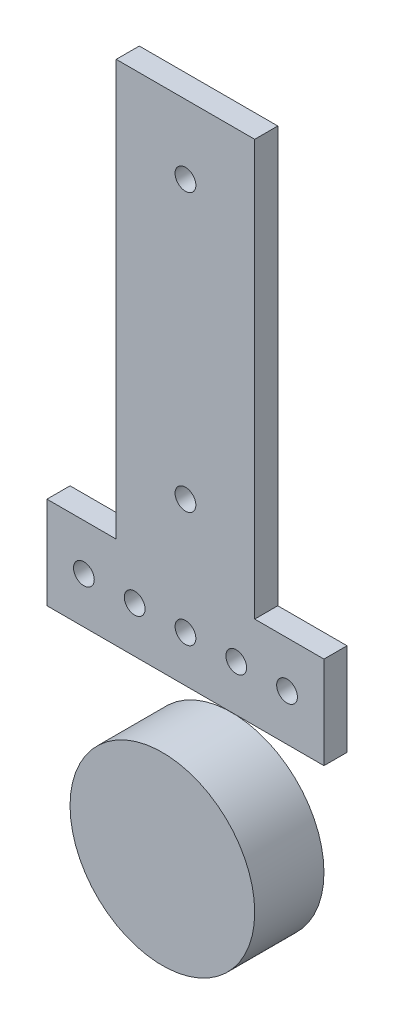
ISO-10303-21;
HEADER;
FILE_DESCRIPTION(('STEP AP214'),'2;1');
FILE_NAME('part.step','',(''),(''),'','','');
FILE_SCHEMA(('AUTOMOTIVE_DESIGN { 1 0 10303 214 1 1 1 1 }'));
ENDSEC;
DATA;
#1=APPLICATION_CONTEXT('core data for automotive mechanical design processes');
#2=APPLICATION_PROTOCOL_DEFINITION('international standard','automotive_design',2000,#1);
#3=PRODUCT_CONTEXT('',#1,'mechanical');
#4=PRODUCT('Part','Part','',(#3));
#5=PRODUCT_RELATED_PRODUCT_CATEGORY('part','',(#4));
#6=PRODUCT_DEFINITION_FORMATION('','',#4);
#7=PRODUCT_DEFINITION_CONTEXT('part definition',#1,'design');
#8=PRODUCT_DEFINITION('design','',#6,#7);
#9=PRODUCT_DEFINITION_SHAPE('','',#8);
#10=(LENGTH_UNIT() NAMED_UNIT(*) SI_UNIT(.MILLI.,.METRE.));
#11=(NAMED_UNIT(*) PLANE_ANGLE_UNIT() SI_UNIT($,.RADIAN.));
#12=(NAMED_UNIT(*) SI_UNIT($,.STERADIAN.) SOLID_ANGLE_UNIT());
#13=UNCERTAINTY_MEASURE_WITH_UNIT(LENGTH_MEASURE(1.E-05),#10,'distance_accuracy_value','');
#14=(GEOMETRIC_REPRESENTATION_CONTEXT(3) GLOBAL_UNCERTAINTY_ASSIGNED_CONTEXT((#13)) GLOBAL_UNIT_ASSIGNED_CONTEXT((#10,
#11,#12)) REPRESENTATION_CONTEXT('',''));
#15=CARTESIAN_POINT('',(0.,0.,0.));
#16=DIRECTION('',(0.,0.,1.));
#17=DIRECTION('',(1.,0.,0.));
#18=AXIS2_PLACEMENT_3D('',#15,#16,#17);
#19=CARTESIAN_POINT('',(0.,-65.,7.5));
#20=DIRECTION('',(0.,0.,-1.));
#21=DIRECTION('',(-1.,0.,0.));
#22=AXIS2_PLACEMENT_3D('',#19,#20,#21);
#23=CYLINDRICAL_SURFACE('',#22,20.);
#24=CARTESIAN_POINT('',(0.,-65.,7.5));
#25=DIRECTION('',(0.,0.,1.));
#26=DIRECTION('',(1.,0.,0.));
#27=AXIS2_PLACEMENT_3D('',#24,#25,#26);
#28=CIRCLE('',#27,20.);
#29=CARTESIAN_POINT('',(20.,-65.,7.5));
#30=VERTEX_POINT('',#29);
#31=EDGE_CURVE('E11',#30,#30,#28,.T.);
#32=ORIENTED_EDGE('',*,*,#31,.F.);
#33=EDGE_LOOP('',(#32));
#34=FACE_BOUND('',#33,.T.);
#35=CARTESIAN_POINT('',(0.,-65.,-7.5));
#36=DIRECTION('',(0.,0.,1.));
#37=DIRECTION('',(1.,0.,0.));
#38=AXIS2_PLACEMENT_3D('',#35,#36,#37);
#39=CIRCLE('',#38,20.);
#40=CARTESIAN_POINT('',(20.,-65.,-7.5));
#41=VERTEX_POINT('',#40);
#42=EDGE_CURVE('E50',#41,#41,#39,.T.);
#43=ORIENTED_EDGE('',*,*,#42,.T.);
#44=EDGE_LOOP('',(#43));
#45=FACE_BOUND('',#44,.T.);
#46=ADVANCED_FACE('F47',(#34,#45),#23,.T.);
#47=CARTESIAN_POINT('',(0.,0.,7.5));
#48=DIRECTION('',(0.,0.,1.));
#49=DIRECTION('',(1.,0.,0.));
#50=AXIS2_PLACEMENT_3D('',#47,#48,#49);
#51=PLANE('',#50);
#52=ORIENTED_EDGE('',*,*,#31,.T.);
#53=EDGE_LOOP('',(#52));
#54=FACE_BOUND('',#53,.T.);
#55=ADVANCED_FACE('F62',(#54),#51,.T.);
#56=CARTESIAN_POINT('',(0.,0.,-7.5));
#57=DIRECTION('',(0.,0.,1.));
#58=DIRECTION('',(1.,0.,0.));
#59=AXIS2_PLACEMENT_3D('',#56,#57,#58);
#60=PLANE('',#59);
#61=ORIENTED_EDGE('',*,*,#42,.F.);
#62=EDGE_LOOP('',(#61));
#63=FACE_BOUND('',#62,.T.);
#64=ADVANCED_FACE('F60',(#63),#60,.F.);
#65=CLOSED_SHELL('',(#46,#55,#64));
#66=MANIFOLD_SOLID_BREP('B2',#65);
#67=CARTESIAN_POINT('',(-14.9999999999998,0.,2.5));
#68=DIRECTION('',(-1.,0.,0.));
#69=DIRECTION('',(0.,-1.,0.));
#70=AXIS2_PLACEMENT_3D('',#67,#68,#69);
#71=PLANE('',#70);
#72=DIRECTION('',(0.,1.,0.));
#73=VECTOR('',#72,1.);
#74=CARTESIAN_POINT('',(-14.9999999999998,0.,-2.5));
#75=LINE('',#74,#73);
#76=CARTESIAN_POINT('',(-14.9999999999997,-15.,-2.5));
#77=VERTEX_POINT('',#76);
#78=CARTESIAN_POINT('',(-14.9999999999998,75.,-2.5));
#79=VERTEX_POINT('',#78);
#80=EDGE_CURVE('E255',#77,#79,#75,.T.);
#81=ORIENTED_EDGE('',*,*,#80,.F.);
#82=DIRECTION('',(0.,0.,-1.));
#83=VECTOR('',#82,1.);
#84=CARTESIAN_POINT('',(-14.9999999999997,-15.,2.5));
#85=LINE('',#84,#83);
#86=CARTESIAN_POINT('',(-14.9999999999997,-15.,2.5));
#87=VERTEX_POINT('',#86);
#88=EDGE_CURVE('E45',#87,#77,#85,.T.);
#89=ORIENTED_EDGE('',*,*,#88,.F.);
#90=DIRECTION('',(0.,1.,0.));
#91=VECTOR('',#90,1.);
#92=CARTESIAN_POINT('',(-14.9999999999998,0.,2.5));
#93=LINE('',#92,#91);
#94=CARTESIAN_POINT('',(-14.9999999999998,75.,2.5));
#95=VERTEX_POINT('',#94);
#96=EDGE_CURVE('E193',#87,#95,#93,.T.);
#97=ORIENTED_EDGE('',*,*,#96,.T.);
#98=DIRECTION('',(0.,0.,-1.));
#99=VECTOR('',#98,1.);
#100=CARTESIAN_POINT('',(-14.9999999999998,75.,2.5));
#101=LINE('',#100,#99);
#102=EDGE_CURVE('E140',#95,#79,#101,.T.);
#103=ORIENTED_EDGE('',*,*,#102,.T.);
#104=EDGE_LOOP('',(#81,#89,#97,#103));
#105=FACE_BOUND('',#104,.T.);
#106=ADVANCED_FACE('F87',(#105),#71,.T.);
#107=CARTESIAN_POINT('',(0.,-15.,2.5));
#108=DIRECTION('',(0.,1.,0.));
#109=DIRECTION('',(-1.,0.,0.));
#110=AXIS2_PLACEMENT_3D('',#107,#108,#109);
#111=PLANE('',#110);
#112=DIRECTION('',(1.,0.,0.));
#113=VECTOR('',#112,1.);
#114=CARTESIAN_POINT('',(0.,-15.,-2.5));
#115=LINE('',#114,#113);
#116=CARTESIAN_POINT('',(-30.,-15.,-2.5));
#117=VERTEX_POINT('',#116);
#118=EDGE_CURVE('E247',#117,#77,#115,.T.);
#119=ORIENTED_EDGE('',*,*,#118,.F.);
#120=DIRECTION('',(0.,0.,-1.));
#121=VECTOR('',#120,1.);
#122=CARTESIAN_POINT('',(-30.,-15.,2.5));
#123=LINE('',#122,#121);
#124=CARTESIAN_POINT('',(-30.,-15.,2.5));
#125=VERTEX_POINT('',#124);
#126=EDGE_CURVE('E97',#125,#117,#123,.T.);
#127=ORIENTED_EDGE('',*,*,#126,.F.);
#128=DIRECTION('',(1.,0.,0.));
#129=VECTOR('',#128,1.);
#130=CARTESIAN_POINT('',(0.,-15.,2.5));
#131=LINE('',#130,#129);
#132=EDGE_CURVE('E184',#125,#87,#131,.T.);
#133=ORIENTED_EDGE('',*,*,#132,.T.);
#134=ORIENTED_EDGE('',*,*,#88,.T.);
#135=EDGE_LOOP('',(#119,#127,#133,#134));
#136=FACE_BOUND('',#135,.T.);
#137=ADVANCED_FACE('F253',(#136),#111,.T.);
#138=CARTESIAN_POINT('',(-30.,0.,2.5));
#139=DIRECTION('',(1.,0.,0.));
#140=DIRECTION('',(0.,1.,0.));
#141=AXIS2_PLACEMENT_3D('',#138,#139,#140);
#142=PLANE('',#141);
#143=DIRECTION('',(0.,-1.,0.));
#144=VECTOR('',#143,1.);
#145=CARTESIAN_POINT('',(-30.,0.,-2.5));
#146=LINE('',#145,#144);
#147=CARTESIAN_POINT('',(-30.,-34.9999999999998,-2.5));
#148=VERTEX_POINT('',#147);
#149=EDGE_CURVE('E242',#117,#148,#146,.T.);
#150=ORIENTED_EDGE('',*,*,#149,.T.);
#151=DIRECTION('',(0.,0.,-1.));
#152=VECTOR('',#151,1.);
#153=CARTESIAN_POINT('',(-30.,-34.9999999999998,2.5));
#154=LINE('',#153,#152);
#155=CARTESIAN_POINT('',(-30.,-34.9999999999998,2.5));
#156=VERTEX_POINT('',#155);
#157=EDGE_CURVE('E232',#156,#148,#154,.T.);
#158=ORIENTED_EDGE('',*,*,#157,.F.);
#159=DIRECTION('',(0.,-1.,0.));
#160=VECTOR('',#159,1.);
#161=CARTESIAN_POINT('',(-30.,0.,2.5));
#162=LINE('',#161,#160);
#163=EDGE_CURVE('E192',#125,#156,#162,.T.);
#164=ORIENTED_EDGE('',*,*,#163,.F.);
#165=ORIENTED_EDGE('',*,*,#126,.T.);
#166=EDGE_LOOP('',(#150,#158,#164,#165));
#167=FACE_BOUND('',#166,.T.);
#168=ADVANCED_FACE('F240',(#167),#142,.F.);
#169=CARTESIAN_POINT('',(0.,-34.9999999999998,2.5));
#170=DIRECTION('',(0.,1.,0.));
#171=DIRECTION('',(-1.,0.,0.));
#172=AXIS2_PLACEMENT_3D('',#169,#170,#171);
#173=PLANE('',#172);
#174=DIRECTION('',(1.,0.,0.));
#175=VECTOR('',#174,1.);
#176=CARTESIAN_POINT('',(0.,-34.9999999999998,-2.5));
#177=LINE('',#176,#175);
#178=CARTESIAN_POINT('',(30.,-34.9999999999998,-2.5));
#179=VERTEX_POINT('',#178);
#180=EDGE_CURVE('E250',#148,#179,#177,.T.);
#181=ORIENTED_EDGE('',*,*,#180,.T.);
#182=DIRECTION('',(0.,0.,-1.));
#183=VECTOR('',#182,1.);
#184=CARTESIAN_POINT('',(30.,-34.9999999999998,2.5));
#185=LINE('',#184,#183);
#186=CARTESIAN_POINT('',(30.,-34.9999999999998,2.5));
#187=VERTEX_POINT('',#186);
#188=EDGE_CURVE('E229',#187,#179,#185,.T.);
#189=ORIENTED_EDGE('',*,*,#188,.F.);
#190=DIRECTION('',(1.,0.,0.));
#191=VECTOR('',#190,1.);
#192=CARTESIAN_POINT('',(0.,-34.9999999999998,2.5));
#193=LINE('',#192,#191);
#194=EDGE_CURVE('E186',#156,#187,#193,.T.);
#195=ORIENTED_EDGE('',*,*,#194,.F.);
#196=ORIENTED_EDGE('',*,*,#157,.T.);
#197=EDGE_LOOP('',(#181,#189,#195,#196));
#198=FACE_BOUND('',#197,.T.);
#199=ADVANCED_FACE('F356',(#198),#173,.F.);
#200=CARTESIAN_POINT('',(30.,0.,2.5));
#201=DIRECTION('',(1.,0.,0.));
#202=DIRECTION('',(0.,0.,-1.));
#203=AXIS2_PLACEMENT_3D('',#200,#201,#202);
#204=PLANE('',#203);
#205=DIRECTION('',(0.,-1.,0.));
#206=VECTOR('',#205,1.);
#207=CARTESIAN_POINT('',(30.,0.,-2.5));
#208=LINE('',#207,#206);
#209=CARTESIAN_POINT('',(30.,-15.,-2.5));
#210=VERTEX_POINT('',#209);
#211=EDGE_CURVE('E262',#210,#179,#208,.T.);
#212=ORIENTED_EDGE('',*,*,#211,.F.);
#213=DIRECTION('',(0.,0.,-1.));
#214=VECTOR('',#213,1.);
#215=CARTESIAN_POINT('',(30.,-15.,2.5));
#216=LINE('',#215,#214);
#217=CARTESIAN_POINT('',(30.,-15.,2.5));
#218=VERTEX_POINT('',#217);
#219=EDGE_CURVE('E169',#218,#210,#216,.T.);
#220=ORIENTED_EDGE('',*,*,#219,.F.);
#221=DIRECTION('',(0.,-1.,0.));
#222=VECTOR('',#221,1.);
#223=CARTESIAN_POINT('',(30.,0.,2.5));
#224=LINE('',#223,#222);
#225=EDGE_CURVE('E181',#218,#187,#224,.T.);
#226=ORIENTED_EDGE('',*,*,#225,.T.);
#227=ORIENTED_EDGE('',*,*,#188,.T.);
#228=EDGE_LOOP('',(#212,#220,#226,#227));
#229=FACE_BOUND('',#228,.T.);
#230=ADVANCED_FACE('F358',(#229),#204,.T.);
#231=CARTESIAN_POINT('',(14.9999999999998,-15.,-2.5));
#232=VERTEX_POINT('',#231);
#233=EDGE_CURVE('E165',#232,#210,#115,.T.);
#234=ORIENTED_EDGE('',*,*,#233,.F.);
#235=DIRECTION('',(0.,0.,-1.));
#236=VECTOR('',#235,1.);
#237=CARTESIAN_POINT('',(14.9999999999998,-15.,2.5));
#238=LINE('',#237,#236);
#239=CARTESIAN_POINT('',(14.9999999999998,-15.,2.5));
#240=VERTEX_POINT('',#239);
#241=EDGE_CURVE('E159',#240,#232,#238,.T.);
#242=ORIENTED_EDGE('',*,*,#241,.F.);
#243=EDGE_CURVE('E163',#240,#218,#131,.T.);
#244=ORIENTED_EDGE('',*,*,#243,.T.);
#245=ORIENTED_EDGE('',*,*,#219,.T.);
#246=EDGE_LOOP('',(#234,#242,#244,#245));
#247=FACE_BOUND('',#246,.T.);
#248=ADVANCED_FACE('F161',(#247),#111,.T.);
#249=CARTESIAN_POINT('',(14.9999999999998,0.,2.5));
#250=DIRECTION('',(-1.,0.,0.));
#251=DIRECTION('',(0.,0.,1.));
#252=AXIS2_PLACEMENT_3D('',#249,#250,#251);
#253=PLANE('',#252);
#254=DIRECTION('',(0.,1.,0.));
#255=VECTOR('',#254,1.);
#256=CARTESIAN_POINT('',(14.9999999999998,0.,-2.5));
#257=LINE('',#256,#255);
#258=CARTESIAN_POINT('',(14.9999999999998,75.,-2.5));
#259=VERTEX_POINT('',#258);
#260=EDGE_CURVE('E261',#232,#259,#257,.T.);
#261=ORIENTED_EDGE('',*,*,#260,.T.);
#262=DIRECTION('',(0.,0.,-1.));
#263=VECTOR('',#262,1.);
#264=CARTESIAN_POINT('',(14.9999999999998,75.,2.5));
#265=LINE('',#264,#263);
#266=CARTESIAN_POINT('',(14.9999999999998,75.,2.5));
#267=VERTEX_POINT('',#266);
#268=EDGE_CURVE('E170',#267,#259,#265,.T.);
#269=ORIENTED_EDGE('',*,*,#268,.F.);
#270=DIRECTION('',(0.,1.,0.));
#271=VECTOR('',#270,1.);
#272=CARTESIAN_POINT('',(14.9999999999998,0.,2.5));
#273=LINE('',#272,#271);
#274=EDGE_CURVE('E173',#240,#267,#273,.T.);
#275=ORIENTED_EDGE('',*,*,#274,.F.);
#276=ORIENTED_EDGE('',*,*,#241,.T.);
#277=EDGE_LOOP('',(#261,#269,#275,#276));
#278=FACE_BOUND('',#277,.T.);
#279=ADVANCED_FACE('F174',(#278),#253,.F.);
#280=CARTESIAN_POINT('',(11.,-24.9999999999999,2.5));
#281=DIRECTION('',(0.,0.,-1.));
#282=DIRECTION('',(-1.,0.,0.));
#283=AXIS2_PLACEMENT_3D('',#280,#281,#282);
#284=CYLINDRICAL_SURFACE('',#283,2.25);
#285=CARTESIAN_POINT('',(11.,-24.9999999999999,2.5));
#286=DIRECTION('',(0.,0.,1.));
#287=DIRECTION('',(1.,0.,0.));
#288=AXIS2_PLACEMENT_3D('',#285,#286,#287);
#289=CIRCLE('',#288,2.25);
#290=CARTESIAN_POINT('',(13.25,-24.9999999999999,2.5));
#291=VERTEX_POINT('',#290);
#292=EDGE_CURVE('E336',#291,#291,#289,.T.);
#293=ORIENTED_EDGE('',*,*,#292,.T.);
#294=EDGE_LOOP('',(#293));
#295=FACE_BOUND('',#294,.T.);
#296=CARTESIAN_POINT('',(11.,-24.9999999999999,-2.5));
#297=DIRECTION('',(0.,0.,1.));
#298=DIRECTION('',(1.,0.,0.));
#299=AXIS2_PLACEMENT_3D('',#296,#297,#298);
#300=CIRCLE('',#299,2.25);
#301=CARTESIAN_POINT('',(13.25,-24.9999999999999,-2.5));
#302=VERTEX_POINT('',#301);
#303=EDGE_CURVE('E212',#302,#302,#300,.T.);
#304=ORIENTED_EDGE('',*,*,#303,.F.);
#305=EDGE_LOOP('',(#304));
#306=FACE_BOUND('',#305,.T.);
#307=ADVANCED_FACE('F289',(#295,#306),#284,.F.);
#308=CARTESIAN_POINT('',(22.,-24.9999999999999,2.5));
#309=DIRECTION('',(0.,0.,-1.));
#310=DIRECTION('',(-1.,0.,0.));
#311=AXIS2_PLACEMENT_3D('',#308,#309,#310);
#312=CYLINDRICAL_SURFACE('',#311,2.25);
#313=CARTESIAN_POINT('',(22.,-24.9999999999999,2.5));
#314=DIRECTION('',(0.,0.,1.));
#315=DIRECTION('',(1.,0.,0.));
#316=AXIS2_PLACEMENT_3D('',#313,#314,#315);
#317=CIRCLE('',#316,2.25);
#318=CARTESIAN_POINT('',(24.25,-24.9999999999999,2.5));
#319=VERTEX_POINT('',#318);
#320=EDGE_CURVE('E340',#319,#319,#317,.T.);
#321=ORIENTED_EDGE('',*,*,#320,.T.);
#322=EDGE_LOOP('',(#321));
#323=FACE_BOUND('',#322,.T.);
#324=CARTESIAN_POINT('',(22.,-24.9999999999999,-2.5));
#325=DIRECTION('',(0.,0.,1.));
#326=DIRECTION('',(1.,0.,0.));
#327=AXIS2_PLACEMENT_3D('',#324,#325,#326);
#328=CIRCLE('',#327,2.25);
#329=CARTESIAN_POINT('',(24.25,-24.9999999999999,-2.5));
#330=VERTEX_POINT('',#329);
#331=EDGE_CURVE('E218',#330,#330,#328,.T.);
#332=ORIENTED_EDGE('',*,*,#331,.F.);
#333=EDGE_LOOP('',(#332));
#334=FACE_BOUND('',#333,.T.);
#335=ADVANCED_FACE('F286',(#323,#334),#312,.F.);
#336=CARTESIAN_POINT('',(-11.,-25.,2.5));
#337=DIRECTION('',(0.,0.,-1.));
#338=DIRECTION('',(-1.,0.,0.));
#339=AXIS2_PLACEMENT_3D('',#336,#337,#338);
#340=CYLINDRICAL_SURFACE('',#339,2.25);
#341=CARTESIAN_POINT('',(-11.,-25.,2.5));
#342=DIRECTION('',(0.,0.,1.));
#343=DIRECTION('',(1.,0.,0.));
#344=AXIS2_PLACEMENT_3D('',#341,#342,#343);
#345=CIRCLE('',#344,2.25);
#346=CARTESIAN_POINT('',(-8.74999999999997,-25.,2.5));
#347=VERTEX_POINT('',#346);
#348=EDGE_CURVE('E343',#347,#347,#345,.T.);
#349=ORIENTED_EDGE('',*,*,#348,.T.);
#350=EDGE_LOOP('',(#349));
#351=FACE_BOUND('',#350,.T.);
#352=CARTESIAN_POINT('',(-11.,-25.,-2.5));
#353=DIRECTION('',(0.,0.,1.));
#354=DIRECTION('',(1.,0.,0.));
#355=AXIS2_PLACEMENT_3D('',#352,#353,#354);
#356=CIRCLE('',#355,2.25);
#357=CARTESIAN_POINT('',(-8.74999999999997,-25.,-2.5));
#358=VERTEX_POINT('',#357);
#359=EDGE_CURVE('E277',#358,#358,#356,.T.);
#360=ORIENTED_EDGE('',*,*,#359,.F.);
#361=EDGE_LOOP('',(#360));
#362=FACE_BOUND('',#361,.T.);
#363=ADVANCED_FACE('F288',(#351,#362),#340,.F.);
#364=CARTESIAN_POINT('',(-22.,-25.0000000000001,2.5));
#365=DIRECTION('',(0.,0.,-1.));
#366=DIRECTION('',(-1.,0.,0.));
#367=AXIS2_PLACEMENT_3D('',#364,#365,#366);
#368=CYLINDRICAL_SURFACE('',#367,2.25);
#369=CARTESIAN_POINT('',(-22.,-25.0000000000001,2.5));
#370=DIRECTION('',(0.,0.,1.));
#371=DIRECTION('',(1.,0.,0.));
#372=AXIS2_PLACEMENT_3D('',#369,#370,#371);
#373=CIRCLE('',#372,2.25);
#374=CARTESIAN_POINT('',(-19.75,-25.0000000000001,2.5));
#375=VERTEX_POINT('',#374);
#376=EDGE_CURVE('E347',#375,#375,#373,.T.);
#377=ORIENTED_EDGE('',*,*,#376,.T.);
#378=EDGE_LOOP('',(#377));
#379=FACE_BOUND('',#378,.T.);
#380=CARTESIAN_POINT('',(-22.,-25.0000000000001,-2.5));
#381=DIRECTION('',(0.,0.,1.));
#382=DIRECTION('',(1.,0.,0.));
#383=AXIS2_PLACEMENT_3D('',#380,#381,#382);
#384=CIRCLE('',#383,2.25);
#385=CARTESIAN_POINT('',(-19.75,-25.0000000000001,-2.5));
#386=VERTEX_POINT('',#385);
#387=EDGE_CURVE('E273',#386,#386,#384,.T.);
#388=ORIENTED_EDGE('',*,*,#387,.F.);
#389=EDGE_LOOP('',(#388));
#390=FACE_BOUND('',#389,.T.);
#391=ADVANCED_FACE('F296',(#379,#390),#368,.F.);
#392=CARTESIAN_POINT('',(0.,75.,2.5));
#393=DIRECTION('',(0.,-1.,0.));
#394=DIRECTION('',(1.,0.,0.));
#395=AXIS2_PLACEMENT_3D('',#392,#393,#394);
#396=PLANE('',#395);
#397=DIRECTION('',(-1.,0.,0.));
#398=VECTOR('',#397,1.);
#399=CARTESIAN_POINT('',(0.,75.,-2.5));
#400=LINE('',#399,#398);
#401=EDGE_CURVE('E133',#259,#79,#400,.T.);
#402=ORIENTED_EDGE('',*,*,#401,.T.);
#403=ORIENTED_EDGE('',*,*,#102,.F.);
#404=DIRECTION('',(-1.,0.,0.));
#405=VECTOR('',#404,1.);
#406=CARTESIAN_POINT('',(0.,75.,2.5));
#407=LINE('',#406,#405);
#408=EDGE_CURVE('E105',#267,#95,#407,.T.);
#409=ORIENTED_EDGE('',*,*,#408,.F.);
#410=ORIENTED_EDGE('',*,*,#268,.T.);
#411=EDGE_LOOP('',(#402,#403,#409,#410));
#412=FACE_BOUND('',#411,.T.);
#413=ADVANCED_FACE('F312',(#412),#396,.F.);
#414=CARTESIAN_POINT('',(0.,0.,2.5));
#415=DIRECTION('',(0.,0.,-1.));
#416=DIRECTION('',(-1.,0.,0.));
#417=AXIS2_PLACEMENT_3D('',#414,#415,#416);
#418=CYLINDRICAL_SURFACE('',#417,2.25);
#419=CARTESIAN_POINT('',(0.,0.,2.5));
#420=DIRECTION('',(0.,0.,1.));
#421=DIRECTION('',(1.,0.,0.));
#422=AXIS2_PLACEMENT_3D('',#419,#420,#421);
#423=CIRCLE('',#422,2.25);
#424=CARTESIAN_POINT('',(2.25,0.,2.5));
#425=VERTEX_POINT('',#424);
#426=EDGE_CURVE('E199',#425,#425,#423,.T.);
#427=ORIENTED_EDGE('',*,*,#426,.T.);
#428=EDGE_LOOP('',(#427));
#429=FACE_BOUND('',#428,.T.);
#430=CARTESIAN_POINT('',(0.,0.,-2.5));
#431=DIRECTION('',(0.,0.,1.));
#432=DIRECTION('',(1.,0.,0.));
#433=AXIS2_PLACEMENT_3D('',#430,#431,#432);
#434=CIRCLE('',#433,2.25);
#435=CARTESIAN_POINT('',(2.25,0.,-2.5));
#436=VERTEX_POINT('',#435);
#437=EDGE_CURVE('E258',#436,#436,#434,.T.);
#438=ORIENTED_EDGE('',*,*,#437,.F.);
#439=EDGE_LOOP('',(#438));
#440=FACE_BOUND('',#439,.T.);
#441=ADVANCED_FACE('F310',(#429,#440),#418,.F.);
#442=CARTESIAN_POINT('',(-2.05814939933146E-13,60.,2.5));
#443=DIRECTION('',(0.,0.,-1.));
#444=DIRECTION('',(-1.,0.,0.));
#445=AXIS2_PLACEMENT_3D('',#442,#443,#444);
#446=CYLINDRICAL_SURFACE('',#445,2.25);
#447=CARTESIAN_POINT('',(-2.05814939933146E-13,60.,2.5));
#448=DIRECTION('',(0.,0.,1.));
#449=DIRECTION('',(1.,0.,0.));
#450=AXIS2_PLACEMENT_3D('',#447,#448,#449);
#451=CIRCLE('',#450,2.25);
#452=CARTESIAN_POINT('',(2.24999999999979,60.,2.5));
#453=VERTEX_POINT('',#452);
#454=EDGE_CURVE('E202',#453,#453,#451,.T.);
#455=ORIENTED_EDGE('',*,*,#454,.T.);
#456=EDGE_LOOP('',(#455));
#457=FACE_BOUND('',#456,.T.);
#458=CARTESIAN_POINT('',(-2.05814939933146E-13,60.,-2.5));
#459=DIRECTION('',(0.,0.,1.));
#460=DIRECTION('',(1.,0.,0.));
#461=AXIS2_PLACEMENT_3D('',#458,#459,#460);
#462=CIRCLE('',#461,2.25);
#463=CARTESIAN_POINT('',(2.24999999999979,60.,-2.5));
#464=VERTEX_POINT('',#463);
#465=EDGE_CURVE('E327',#464,#464,#462,.T.);
#466=ORIENTED_EDGE('',*,*,#465,.F.);
#467=EDGE_LOOP('',(#466));
#468=FACE_BOUND('',#467,.T.);
#469=ADVANCED_FACE('F89',(#457,#468),#446,.F.);
#470=CARTESIAN_POINT('',(0.,-24.9999999999999,2.5));
#471=DIRECTION('',(0.,0.,-1.));
#472=DIRECTION('',(-1.,0.,0.));
#473=AXIS2_PLACEMENT_3D('',#470,#471,#472);
#474=CYLINDRICAL_SURFACE('',#473,2.25);
#475=CARTESIAN_POINT('',(0.,-24.9999999999999,2.5));
#476=DIRECTION('',(0.,0.,1.));
#477=DIRECTION('',(1.,0.,0.));
#478=AXIS2_PLACEMENT_3D('',#475,#476,#477);
#479=CIRCLE('',#478,2.25);
#480=CARTESIAN_POINT('',(2.25000000000003,-24.9999999999999,2.5));
#481=VERTEX_POINT('',#480);
#482=EDGE_CURVE('E224',#481,#481,#479,.T.);
#483=ORIENTED_EDGE('',*,*,#482,.T.);
#484=EDGE_LOOP('',(#483));
#485=FACE_BOUND('',#484,.T.);
#486=CARTESIAN_POINT('',(0.,-24.9999999999999,-2.5));
#487=DIRECTION('',(0.,0.,1.));
#488=DIRECTION('',(1.,0.,0.));
#489=AXIS2_PLACEMENT_3D('',#486,#487,#488);
#490=CIRCLE('',#489,2.25);
#491=CARTESIAN_POINT('',(2.25000000000003,-24.9999999999999,-2.5));
#492=VERTEX_POINT('',#491);
#493=EDGE_CURVE('E207',#492,#492,#490,.T.);
#494=ORIENTED_EDGE('',*,*,#493,.F.);
#495=EDGE_LOOP('',(#494));
#496=FACE_BOUND('',#495,.T.);
#497=ADVANCED_FACE('F318',(#485,#496),#474,.F.);
#498=CARTESIAN_POINT('',(0.,0.,2.5));
#499=DIRECTION('',(0.,0.,1.));
#500=DIRECTION('',(1.,0.,0.));
#501=AXIS2_PLACEMENT_3D('',#498,#499,#500);
#502=PLANE('',#501);
#503=ORIENTED_EDGE('',*,*,#454,.F.);
#504=EDGE_LOOP('',(#503));
#505=FACE_BOUND('',#504,.T.);
#506=ORIENTED_EDGE('',*,*,#426,.F.);
#507=EDGE_LOOP('',(#506));
#508=FACE_BOUND('',#507,.T.);
#509=ORIENTED_EDGE('',*,*,#96,.F.);
#510=ORIENTED_EDGE('',*,*,#132,.F.);
#511=ORIENTED_EDGE('',*,*,#163,.T.);
#512=ORIENTED_EDGE('',*,*,#194,.T.);
#513=ORIENTED_EDGE('',*,*,#225,.F.);
#514=ORIENTED_EDGE('',*,*,#243,.F.);
#515=ORIENTED_EDGE('',*,*,#274,.T.);
#516=ORIENTED_EDGE('',*,*,#408,.T.);
#517=EDGE_LOOP('',(#509,#510,#511,#512,#513,#514,#515,#516));
#518=FACE_BOUND('',#517,.T.);
#519=ORIENTED_EDGE('',*,*,#376,.F.);
#520=EDGE_LOOP('',(#519));
#521=FACE_BOUND('',#520,.T.);
#522=ORIENTED_EDGE('',*,*,#348,.F.);
#523=EDGE_LOOP('',(#522));
#524=FACE_BOUND('',#523,.T.);
#525=ORIENTED_EDGE('',*,*,#320,.F.);
#526=EDGE_LOOP('',(#525));
#527=FACE_BOUND('',#526,.T.);
#528=ORIENTED_EDGE('',*,*,#292,.F.);
#529=EDGE_LOOP('',(#528));
#530=FACE_BOUND('',#529,.T.);
#531=ORIENTED_EDGE('',*,*,#482,.F.);
#532=EDGE_LOOP('',(#531));
#533=FACE_BOUND('',#532,.T.);
#534=ADVANCED_FACE('F178',(#505,#508,#518,#521,#524,#527,#530,#533),#502,.T.);
#535=CARTESIAN_POINT('',(0.,0.,-2.5));
#536=DIRECTION('',(0.,0.,1.));
#537=DIRECTION('',(1.,0.,0.));
#538=AXIS2_PLACEMENT_3D('',#535,#536,#537);
#539=PLANE('',#538);
#540=ORIENTED_EDGE('',*,*,#465,.T.);
#541=EDGE_LOOP('',(#540));
#542=FACE_BOUND('',#541,.T.);
#543=ORIENTED_EDGE('',*,*,#437,.T.);
#544=EDGE_LOOP('',(#543));
#545=FACE_BOUND('',#544,.T.);
#546=ORIENTED_EDGE('',*,*,#80,.T.);
#547=ORIENTED_EDGE('',*,*,#401,.F.);
#548=ORIENTED_EDGE('',*,*,#260,.F.);
#549=ORIENTED_EDGE('',*,*,#233,.T.);
#550=ORIENTED_EDGE('',*,*,#211,.T.);
#551=ORIENTED_EDGE('',*,*,#180,.F.);
#552=ORIENTED_EDGE('',*,*,#149,.F.);
#553=ORIENTED_EDGE('',*,*,#118,.T.);
#554=EDGE_LOOP('',(#546,#547,#548,#549,#550,#551,#552,#553));
#555=FACE_BOUND('',#554,.T.);
#556=ORIENTED_EDGE('',*,*,#387,.T.);
#557=EDGE_LOOP('',(#556));
#558=FACE_BOUND('',#557,.T.);
#559=ORIENTED_EDGE('',*,*,#359,.T.);
#560=EDGE_LOOP('',(#559));
#561=FACE_BOUND('',#560,.T.);
#562=ORIENTED_EDGE('',*,*,#331,.T.);
#563=EDGE_LOOP('',(#562));
#564=FACE_BOUND('',#563,.T.);
#565=ORIENTED_EDGE('',*,*,#303,.T.);
#566=EDGE_LOOP('',(#565));
#567=FACE_BOUND('',#566,.T.);
#568=ORIENTED_EDGE('',*,*,#493,.T.);
#569=EDGE_LOOP('',(#568));
#570=FACE_BOUND('',#569,.T.);
#571=ADVANCED_FACE('F245',(#542,#545,#555,#558,#561,#564,#567,#570),#539,.F.);
#572=CLOSED_SHELL('',(#106,#137,#168,#199,#230,#248,#279,#307,#335,#363,#391,#413,#441,#469,
#497,#534,#571));
#573=MANIFOLD_SOLID_BREP('B6',#572);
#574=ADVANCED_BREP_SHAPE_REPRESENTATION('',(#18,#66,#573),#14);
#575=SHAPE_DEFINITION_REPRESENTATION(#9,#574);
ENDSEC;
END-ISO-10303-21;
